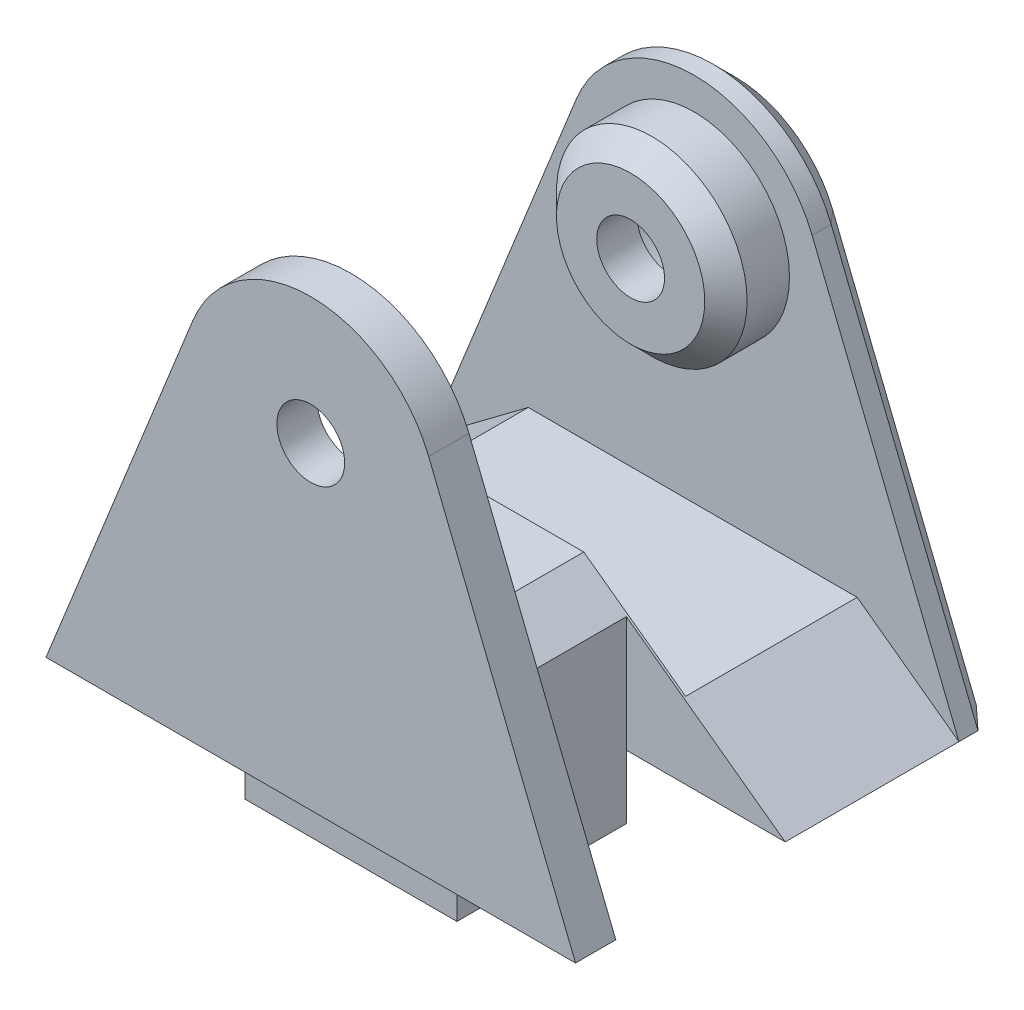
ISO-10303-21;
HEADER;
FILE_DESCRIPTION(('STEP AP214'),'2;1');
FILE_NAME('part.step','',(''),(''),'','','');
FILE_SCHEMA(('AUTOMOTIVE_DESIGN { 1 0 10303 214 1 1 1 1 }'));
ENDSEC;
DATA;
#1=APPLICATION_CONTEXT('core data for automotive mechanical design processes');
#2=APPLICATION_PROTOCOL_DEFINITION('international standard','automotive_design',2000,#1);
#3=PRODUCT_CONTEXT('',#1,'mechanical');
#4=PRODUCT('Part','Part','',(#3));
#5=PRODUCT_RELATED_PRODUCT_CATEGORY('part','',(#4));
#6=PRODUCT_DEFINITION_FORMATION('','',#4);
#7=PRODUCT_DEFINITION_CONTEXT('part definition',#1,'design');
#8=PRODUCT_DEFINITION('design','',#6,#7);
#9=PRODUCT_DEFINITION_SHAPE('','',#8);
#10=(LENGTH_UNIT() NAMED_UNIT(*) SI_UNIT(.MILLI.,.METRE.));
#11=(NAMED_UNIT(*) PLANE_ANGLE_UNIT() SI_UNIT($,.RADIAN.));
#12=(NAMED_UNIT(*) SI_UNIT($,.STERADIAN.) SOLID_ANGLE_UNIT());
#13=UNCERTAINTY_MEASURE_WITH_UNIT(LENGTH_MEASURE(1.E-05),#10,'distance_accuracy_value','');
#14=(GEOMETRIC_REPRESENTATION_CONTEXT(3) GLOBAL_UNCERTAINTY_ASSIGNED_CONTEXT((#13)) GLOBAL_UNIT_ASSIGNED_CONTEXT((#10,
#11,#12)) REPRESENTATION_CONTEXT('',''));
#15=CARTESIAN_POINT('',(0.,0.,0.));
#16=DIRECTION('',(0.,0.,1.));
#17=DIRECTION('',(1.,0.,0.));
#18=AXIS2_PLACEMENT_3D('',#15,#16,#17);
#19=CARTESIAN_POINT('',(0.,0.,10.));
#20=DIRECTION('',(0.,0.,-1.));
#21=DIRECTION('',(-1.,0.,0.));
#22=AXIS2_PLACEMENT_3D('',#19,#20,#21);
#23=CYLINDRICAL_SURFACE('',#22,1.6);
#24=CARTESIAN_POINT('',(0.,0.,-5.1));
#25=DIRECTION('',(0.,0.,1.));
#26=DIRECTION('',(1.,0.,0.));
#27=AXIS2_PLACEMENT_3D('',#24,#25,#26);
#28=CIRCLE('',#27,1.6);
#29=CARTESIAN_POINT('',(1.6,0.,-5.1));
#30=VERTEX_POINT('',#29);
#31=EDGE_CURVE('E383',#30,#30,#28,.T.);
#32=ORIENTED_EDGE('',*,*,#31,.T.);
#33=EDGE_LOOP('',(#32));
#34=FACE_BOUND('',#33,.T.);
#35=CARTESIAN_POINT('',(0.,0.,-7.));
#36=DIRECTION('',(0.,0.,-1.));
#37=DIRECTION('',(-1.,0.,0.));
#38=AXIS2_PLACEMENT_3D('',#35,#36,#37);
#39=CIRCLE('',#38,1.6);
#40=CARTESIAN_POINT('',(-1.6,0.,-7.));
#41=VERTEX_POINT('',#40);
#42=EDGE_CURVE('E379',#41,#41,#39,.T.);
#43=ORIENTED_EDGE('',*,*,#42,.T.);
#44=EDGE_LOOP('',(#43));
#45=FACE_BOUND('',#44,.T.);
#46=ADVANCED_FACE('F50',(#34,#45),#23,.F.);
#47=CARTESIAN_POINT('',(0.,0.,-8.1));
#48=DIRECTION('',(0.,0.,1.));
#49=DIRECTION('',(1.,0.,0.));
#50=AXIS2_PLACEMENT_3D('',#47,#48,#49);
#51=PLANE('',#50);
#52=DIRECTION('',(1.,0.,0.));
#53=VECTOR('',#52,1.);
#54=CARTESIAN_POINT('',(-12.5,-11.5,-8.1));
#55=LINE('',#54,#53);
#56=CARTESIAN_POINT('',(-7.83241761737377,-11.5,-8.1));
#57=VERTEX_POINT('',#56);
#58=CARTESIAN_POINT('',(7.69429140453238,-11.5,-8.1));
#59=VERTEX_POINT('',#58);
#60=EDGE_CURVE('E231',#57,#59,#55,.T.);
#61=ORIENTED_EDGE('',*,*,#60,.T.);
#62=DIRECTION('',(0.808340712738096,-0.588714949810235,0.));
#63=VECTOR('',#62,1.);
#64=CARTESIAN_POINT('',(2.88858280906475,-8.,-8.1));
#65=LINE('',#64,#63);
#66=CARTESIAN_POINT('',(12.5,-15.,-8.1));
#67=VERTEX_POINT('',#66);
#68=EDGE_CURVE('E263',#59,#67,#65,.T.);
#69=ORIENTED_EDGE('',*,*,#68,.T.);
#70=DIRECTION('',(-0.373144399215149,0.927773279058179,0.));
#71=VECTOR('',#70,1.);
#72=CARTESIAN_POINT('',(5.56663967434907,2.23886639529089,-8.1));
#73=LINE('',#72,#71);
#74=CARTESIAN_POINT('',(5.56663967434907,2.23886639529089,-8.1));
#75=VERTEX_POINT('',#74);
#76=EDGE_CURVE('E298',#67,#75,#73,.T.);
#77=ORIENTED_EDGE('',*,*,#76,.T.);
#78=CARTESIAN_POINT('',(0.,0.,-8.1));
#79=DIRECTION('',(0.,0.,1.));
#80=DIRECTION('',(1.,0.,0.));
#81=AXIS2_PLACEMENT_3D('',#78,#79,#80);
#82=CIRCLE('',#81,6.);
#83=CARTESIAN_POINT('',(-5.56663967434907,2.23886639529089,-8.1));
#84=VERTEX_POINT('',#83);
#85=EDGE_CURVE('E296',#75,#84,#82,.T.);
#86=ORIENTED_EDGE('',*,*,#85,.T.);
#87=DIRECTION('',(-0.373144399215149,-0.927773279058179,0.));
#88=VECTOR('',#87,1.);
#89=CARTESIAN_POINT('',(-12.5,-15.,-8.1));
#90=LINE('',#89,#88);
#91=CARTESIAN_POINT('',(-12.5,-15.,-8.1));
#92=VERTEX_POINT('',#91);
#93=EDGE_CURVE('E259',#84,#92,#90,.T.);
#94=ORIENTED_EDGE('',*,*,#93,.T.);
#95=DIRECTION('',(0.800056502112254,0.599924656459379,0.));
#96=VECTOR('',#95,1.);
#97=CARTESIAN_POINT('',(-12.5,-15.,-8.1));
#98=LINE('',#97,#96);
#99=EDGE_CURVE('E251',#92,#57,#98,.T.);
#100=ORIENTED_EDGE('',*,*,#99,.T.);
#101=EDGE_LOOP('',(#61,#69,#77,#86,#94,#100));
#102=FACE_BOUND('',#101,.T.);
#103=CARTESIAN_POINT('',(0.,0.,-8.1));
#104=DIRECTION('',(0.,0.,1.));
#105=DIRECTION('',(1.,0.,0.));
#106=AXIS2_PLACEMENT_3D('',#103,#104,#105);
#107=CIRCLE('',#106,4.5);
#108=CARTESIAN_POINT('',(4.5,0.,-8.1));
#109=VERTEX_POINT('',#108);
#110=EDGE_CURVE('E426',#109,#109,#107,.T.);
#111=ORIENTED_EDGE('',*,*,#110,.F.);
#112=EDGE_LOOP('',(#111));
#113=FACE_BOUND('',#112,.T.);
#114=ADVANCED_FACE('F256',(#102,#113),#51,.T.);
#115=CARTESIAN_POINT('',(12.5,-15.,10.));
#116=DIRECTION('',(0.,1.,0.));
#117=DIRECTION('',(-1.,0.,0.));
#118=AXIS2_PLACEMENT_3D('',#115,#116,#117);
#119=PLANE('',#118);
#120=DIRECTION('',(-1.,0.,0.));
#121=VECTOR('',#120,1.);
#122=CARTESIAN_POINT('',(-5.,-15.,8.1));
#123=LINE('',#122,#121);
#124=CARTESIAN_POINT('',(5.,-15.,8.1));
#125=VERTEX_POINT('',#124);
#126=CARTESIAN_POINT('',(-5.,-15.,8.1));
#127=VERTEX_POINT('',#126);
#128=EDGE_CURVE('E437',#125,#127,#123,.T.);
#129=ORIENTED_EDGE('',*,*,#128,.F.);
#130=DIRECTION('',(1.,0.,0.));
#131=VECTOR('',#130,1.);
#132=CARTESIAN_POINT('',(12.5,-15.,8.1));
#133=LINE('',#132,#131);
#134=CARTESIAN_POINT('',(12.5,-15.,8.1));
#135=VERTEX_POINT('',#134);
#136=EDGE_CURVE('E483',#125,#135,#133,.T.);
#137=ORIENTED_EDGE('',*,*,#136,.T.);
#138=DIRECTION('',(0.,0.,-1.));
#139=VECTOR('',#138,1.);
#140=CARTESIAN_POINT('',(12.5,-15.,10.));
#141=LINE('',#140,#139);
#142=CARTESIAN_POINT('',(12.5,-15.,10.));
#143=VERTEX_POINT('',#142);
#144=EDGE_CURVE('E350',#143,#135,#141,.T.);
#145=ORIENTED_EDGE('',*,*,#144,.F.);
#146=DIRECTION('',(1.,0.,0.));
#147=VECTOR('',#146,1.);
#148=CARTESIAN_POINT('',(12.5,-15.,10.));
#149=LINE('',#148,#147);
#150=CARTESIAN_POINT('',(-12.5,-15.,10.));
#151=VERTEX_POINT('',#150);
#152=EDGE_CURVE('E318',#151,#143,#149,.T.);
#153=ORIENTED_EDGE('',*,*,#152,.F.);
#154=DIRECTION('',(0.,0.,-1.));
#155=VECTOR('',#154,1.);
#156=CARTESIAN_POINT('',(-12.5,-15.,10.));
#157=LINE('',#156,#155);
#158=CARTESIAN_POINT('',(-12.5,-15.,8.1));
#159=VERTEX_POINT('',#158);
#160=EDGE_CURVE('E335',#151,#159,#157,.T.);
#161=ORIENTED_EDGE('',*,*,#160,.T.);
#162=EDGE_CURVE('E489',#159,#127,#133,.T.);
#163=ORIENTED_EDGE('',*,*,#162,.T.);
#164=EDGE_LOOP('',(#129,#137,#145,#153,#161,#163));
#165=FACE_BOUND('',#164,.T.);
#166=ADVANCED_FACE('F567',(#165),#119,.F.);
#167=DIRECTION('',(1.,0.,0.));
#168=VECTOR('',#167,1.);
#169=CARTESIAN_POINT('',(12.5,-15.,-10.));
#170=LINE('',#169,#168);
#171=CARTESIAN_POINT('',(-11.4221504622173,-15.,-10.));
#172=VERTEX_POINT('',#171);
#173=CARTESIAN_POINT('',(11.4221504622173,-15.,-10.));
#174=VERTEX_POINT('',#173);
#175=EDGE_CURVE('E317',#172,#174,#170,.T.);
#176=ORIENTED_EDGE('',*,*,#175,.T.);
#177=DIRECTION('',(0.733085178534328,0.,0.680136839917743));
#178=VECTOR('',#177,1.);
#179=CARTESIAN_POINT('',(8.7739159329794,-15.,-12.4569612329061));
#180=LINE('',#179,#178);
#181=CARTESIAN_POINT('',(12.5,-15.,-9.));
#182=VERTEX_POINT('',#181);
#183=EDGE_CURVE('E398',#174,#182,#180,.T.);
#184=ORIENTED_EDGE('',*,*,#183,.T.);
#185=EDGE_CURVE('E349',#67,#182,#141,.T.);
#186=ORIENTED_EDGE('',*,*,#185,.F.);
#187=DIRECTION('',(0.,0.,-1.));
#188=VECTOR('',#187,1.);
#189=CARTESIAN_POINT('',(12.5,-15.,8.1));
#190=LINE('',#189,#188);
#191=CARTESIAN_POINT('',(12.5,-15.,0.0999999999999994));
#192=VERTEX_POINT('',#191);
#193=EDGE_CURVE('E290',#192,#67,#190,.T.);
#194=ORIENTED_EDGE('',*,*,#193,.F.);
#195=DIRECTION('',(1.,0.,0.));
#196=VECTOR('',#195,1.);
#197=CARTESIAN_POINT('',(12.5,-15.,0.0999999999999994));
#198=LINE('',#197,#196);
#199=CARTESIAN_POINT('',(5.,-15.,0.0999999999999994));
#200=VERTEX_POINT('',#199);
#201=EDGE_CURVE('E271',#200,#192,#198,.T.);
#202=ORIENTED_EDGE('',*,*,#201,.F.);
#203=DIRECTION('',(1.,0.,0.));
#204=VECTOR('',#203,1.);
#205=CARTESIAN_POINT('',(-5.,-15.,0.0999999999999994));
#206=LINE('',#205,#204);
#207=CARTESIAN_POINT('',(-5.,-15.,0.0999999999999994));
#208=VERTEX_POINT('',#207);
#209=EDGE_CURVE('E443',#208,#200,#206,.T.);
#210=ORIENTED_EDGE('',*,*,#209,.F.);
#211=CARTESIAN_POINT('',(-12.5,-15.,0.0999999999999994));
#212=VERTEX_POINT('',#211);
#213=EDGE_CURVE('E490',#212,#208,#198,.T.);
#214=ORIENTED_EDGE('',*,*,#213,.F.);
#215=DIRECTION('',(0.,0.,-1.));
#216=VECTOR('',#215,1.);
#217=CARTESIAN_POINT('',(-12.5,-15.,8.1));
#218=LINE('',#217,#216);
#219=EDGE_CURVE('E287',#212,#92,#218,.T.);
#220=ORIENTED_EDGE('',*,*,#219,.T.);
#221=CARTESIAN_POINT('',(-12.5,-15.,-9.));
#222=VERTEX_POINT('',#221);
#223=EDGE_CURVE('E331',#92,#222,#157,.T.);
#224=ORIENTED_EDGE('',*,*,#223,.T.);
#225=DIRECTION('',(0.733085178534327,0.,-0.680136839917743));
#226=VECTOR('',#225,1.);
#227=CARTESIAN_POINT('',(-12.5,-15.,-9.));
#228=LINE('',#227,#226);
#229=EDGE_CURVE('E396',#222,#172,#228,.T.);
#230=ORIENTED_EDGE('',*,*,#229,.T.);
#231=EDGE_LOOP('',(#176,#184,#186,#194,#202,#210,#214,#220,#224,#230));
#232=FACE_BOUND('',#231,.T.);
#233=ADVANCED_FACE('F505',(#232),#119,.F.);
#234=CARTESIAN_POINT('',(2.88858280906475,-8.,8.1));
#235=DIRECTION('',(0.588714949810235,0.808340712738096,0.));
#236=DIRECTION('',(-0.808340712738096,0.588714949810235,0.));
#237=AXIS2_PLACEMENT_3D('',#234,#235,#236);
#238=PLANE('',#237);
#239=DIRECTION('',(0.808340712738096,-0.588714949810234,0.));
#240=VECTOR('',#239,1.);
#241=CARTESIAN_POINT('',(2.88858280906475,-8.,0.));
#242=LINE('',#241,#240);
#243=CARTESIAN_POINT('',(2.88858280906475,-8.,0.));
#244=VERTEX_POINT('',#243);
#245=CARTESIAN_POINT('',(7.69429140453238,-11.5,0.));
#246=VERTEX_POINT('',#245);
#247=EDGE_CURVE('E254',#244,#246,#242,.T.);
#248=ORIENTED_EDGE('',*,*,#247,.F.);
#249=DIRECTION('',(0.,0.,-1.));
#250=VECTOR('',#249,1.);
#251=CARTESIAN_POINT('',(2.88858280906475,-8.,8.1));
#252=LINE('',#251,#250);
#253=CARTESIAN_POINT('',(2.88858280906475,-8.,8.1));
#254=VERTEX_POINT('',#253);
#255=EDGE_CURVE('E280',#254,#244,#252,.T.);
#256=ORIENTED_EDGE('',*,*,#255,.F.);
#257=DIRECTION('',(0.808340712738096,-0.588714949810235,0.));
#258=VECTOR('',#257,1.);
#259=CARTESIAN_POINT('',(2.88858280906475,-8.,8.1));
#260=LINE('',#259,#258);
#261=CARTESIAN_POINT('',(5.,-9.53774620775862,8.1));
#262=VERTEX_POINT('',#261);
#263=EDGE_CURVE('E262',#254,#262,#260,.T.);
#264=ORIENTED_EDGE('',*,*,#263,.T.);
#265=DIRECTION('',(0.,0.,1.));
#266=VECTOR('',#265,1.);
#267=CARTESIAN_POINT('',(5.,-9.53774620775862,8.1));
#268=LINE('',#267,#266);
#269=CARTESIAN_POINT('',(5.,-9.53774620775862,0.0999999999999994));
#270=VERTEX_POINT('',#269);
#271=EDGE_CURVE('E364',#270,#262,#268,.T.);
#272=ORIENTED_EDGE('',*,*,#271,.F.);
#273=DIRECTION('',(0.808340712738096,-0.588714949810235,0.));
#274=VECTOR('',#273,1.);
#275=CARTESIAN_POINT('',(2.88858280906475,-8.,0.0999999999999994));
#276=LINE('',#275,#274);
#277=EDGE_CURVE('E493',#270,#192,#276,.T.);
#278=ORIENTED_EDGE('',*,*,#277,.T.);
#279=ORIENTED_EDGE('',*,*,#193,.T.);
#280=ORIENTED_EDGE('',*,*,#68,.F.);
#281=DIRECTION('',(0.,0.,-1.));
#282=VECTOR('',#281,1.);
#283=CARTESIAN_POINT('',(7.69429140453238,-11.5,8.1));
#284=LINE('',#283,#282);
#285=EDGE_CURVE('E238',#246,#59,#284,.T.);
#286=ORIENTED_EDGE('',*,*,#285,.F.);
#287=EDGE_LOOP('',(#248,#256,#264,#272,#278,#279,#280,#286));
#288=FACE_BOUND('',#287,.T.);
#289=ADVANCED_FACE('F595',(#288),#238,.T.);
#290=CARTESIAN_POINT('',(-12.5,-15.,8.1));
#291=DIRECTION('',(-0.599924656459379,0.800056502112254,0.));
#292=DIRECTION('',(-0.800056502112254,-0.599924656459379,0.));
#293=AXIS2_PLACEMENT_3D('',#290,#291,#292);
#294=PLANE('',#293);
#295=DIRECTION('',(0.800056502112255,0.599924656459379,0.));
#296=VECTOR('',#295,1.);
#297=CARTESIAN_POINT('',(-12.5,-15.,0.));
#298=LINE('',#297,#296);
#299=CARTESIAN_POINT('',(-7.83241761737377,-11.5,0.));
#300=VERTEX_POINT('',#299);
#301=CARTESIAN_POINT('',(-3.16483523474755,-8.,0.));
#302=VERTEX_POINT('',#301);
#303=EDGE_CURVE('E243',#300,#302,#298,.T.);
#304=ORIENTED_EDGE('',*,*,#303,.F.);
#305=DIRECTION('',(0.,0.,1.));
#306=VECTOR('',#305,1.);
#307=CARTESIAN_POINT('',(-7.83241761737377,-11.5,8.1));
#308=LINE('',#307,#306);
#309=EDGE_CURVE('E235',#57,#300,#308,.T.);
#310=ORIENTED_EDGE('',*,*,#309,.F.);
#311=ORIENTED_EDGE('',*,*,#99,.F.);
#312=ORIENTED_EDGE('',*,*,#219,.F.);
#313=DIRECTION('',(0.800056502112254,0.599924656459379,0.));
#314=VECTOR('',#313,1.);
#315=CARTESIAN_POINT('',(-12.5,-15.,0.0999999999999994));
#316=LINE('',#315,#314);
#317=CARTESIAN_POINT('',(-5.,-9.3761035482291,0.0999999999999994));
#318=VERTEX_POINT('',#317);
#319=EDGE_CURVE('E360',#212,#318,#316,.T.);
#320=ORIENTED_EDGE('',*,*,#319,.T.);
#321=DIRECTION('',(0.,0.,-1.));
#322=VECTOR('',#321,1.);
#323=CARTESIAN_POINT('',(-5.,-9.3761035482291,8.1));
#324=LINE('',#323,#322);
#325=CARTESIAN_POINT('',(-5.,-9.3761035482291,8.1));
#326=VERTEX_POINT('',#325);
#327=EDGE_CURVE('E354',#326,#318,#324,.T.);
#328=ORIENTED_EDGE('',*,*,#327,.F.);
#329=DIRECTION('',(0.800056502112254,0.599924656459379,0.));
#330=VECTOR('',#329,1.);
#331=CARTESIAN_POINT('',(-12.5,-15.,8.1));
#332=LINE('',#331,#330);
#333=CARTESIAN_POINT('',(-3.16483523474755,-8.,8.1));
#334=VERTEX_POINT('',#333);
#335=EDGE_CURVE('E268',#326,#334,#332,.T.);
#336=ORIENTED_EDGE('',*,*,#335,.T.);
#337=DIRECTION('',(0.,0.,-1.));
#338=VECTOR('',#337,1.);
#339=CARTESIAN_POINT('',(-3.16483523474755,-8.,8.1));
#340=LINE('',#339,#338);
#341=EDGE_CURVE('E284',#334,#302,#340,.T.);
#342=ORIENTED_EDGE('',*,*,#341,.T.);
#343=EDGE_LOOP('',(#304,#310,#311,#312,#320,#328,#336,#342));
#344=FACE_BOUND('',#343,.T.);
#345=ADVANCED_FACE('F249',(#344),#294,.T.);
#346=CARTESIAN_POINT('',(5.56663967434907,2.23886639529089,10.));
#347=DIRECTION('',(-0.927773279058179,-0.373144399215149,0.));
#348=DIRECTION('',(0.373144399215149,-0.927773279058179,0.));
#349=AXIS2_PLACEMENT_3D('',#346,#347,#348);
#350=PLANE('',#349);
#351=ORIENTED_EDGE('',*,*,#185,.T.);
#352=DIRECTION('',(-0.373144399215149,0.927773279058179,0.));
#353=VECTOR('',#352,1.);
#354=CARTESIAN_POINT('',(5.56663967434907,2.23886639529089,-9.));
#355=LINE('',#354,#353);
#356=CARTESIAN_POINT('',(5.56663967434907,2.2388663952909,-9.));
#357=VERTEX_POINT('',#356);
#358=EDGE_CURVE('E378',#182,#357,#355,.T.);
#359=ORIENTED_EDGE('',*,*,#358,.T.);
#360=DIRECTION('',(0.,0.,-1.));
#361=VECTOR('',#360,1.);
#362=CARTESIAN_POINT('',(5.56663967434907,2.2388663952909,10.));
#363=LINE('',#362,#361);
#364=EDGE_CURVE('E344',#75,#357,#363,.T.);
#365=ORIENTED_EDGE('',*,*,#364,.F.);
#366=ORIENTED_EDGE('',*,*,#76,.F.);
#367=EDGE_LOOP('',(#351,#359,#365,#366));
#368=FACE_BOUND('',#367,.T.);
#369=ADVANCED_FACE('F540',(#368),#350,.F.);
#370=CARTESIAN_POINT('',(0.,0.,10.));
#371=DIRECTION('',(0.,0.,-1.));
#372=DIRECTION('',(-1.,0.,0.));
#373=AXIS2_PLACEMENT_3D('',#370,#371,#372);
#374=CYLINDRICAL_SURFACE('',#373,6.);
#375=ORIENTED_EDGE('',*,*,#364,.T.);
#376=CARTESIAN_POINT('',(0.,0.,-9.));
#377=DIRECTION('',(0.,0.,-1.));
#378=DIRECTION('',(-1.,0.,0.));
#379=AXIS2_PLACEMENT_3D('',#376,#377,#378);
#380=CIRCLE('',#379,6.);
#381=CARTESIAN_POINT('',(-5.56663967434907,2.23886639529089,-9.));
#382=VERTEX_POINT('',#381);
#383=EDGE_CURVE('E12',#357,#382,#380,.F.);
#384=ORIENTED_EDGE('',*,*,#383,.T.);
#385=DIRECTION('',(0.,0.,-1.));
#386=VECTOR('',#385,1.);
#387=CARTESIAN_POINT('',(-5.56663967434907,2.23886639529089,10.));
#388=LINE('',#387,#386);
#389=EDGE_CURVE('E339',#84,#382,#388,.T.);
#390=ORIENTED_EDGE('',*,*,#389,.F.);
#391=ORIENTED_EDGE('',*,*,#85,.F.);
#392=EDGE_LOOP('',(#375,#384,#390,#391));
#393=FACE_BOUND('',#392,.T.);
#394=ADVANCED_FACE('F543',(#393),#374,.T.);
#395=CARTESIAN_POINT('',(-12.5,-15.,10.));
#396=DIRECTION('',(0.927773279058179,-0.373144399215149,0.));
#397=DIRECTION('',(0.373144399215149,0.927773279058179,0.));
#398=AXIS2_PLACEMENT_3D('',#395,#396,#397);
#399=PLANE('',#398);
#400=ORIENTED_EDGE('',*,*,#389,.T.);
#401=DIRECTION('',(-0.373144399215149,-0.927773279058179,0.));
#402=VECTOR('',#401,1.);
#403=CARTESIAN_POINT('',(-12.5,-15.,-9.));
#404=LINE('',#403,#402);
#405=EDGE_CURVE('E60',#382,#222,#404,.T.);
#406=ORIENTED_EDGE('',*,*,#405,.T.);
#407=ORIENTED_EDGE('',*,*,#223,.F.);
#408=ORIENTED_EDGE('',*,*,#93,.F.);
#409=EDGE_LOOP('',(#400,#406,#407,#408));
#410=FACE_BOUND('',#409,.T.);
#411=ADVANCED_FACE('F544',(#410),#399,.F.);
#412=CARTESIAN_POINT('',(0.,0.,10.));
#413=DIRECTION('',(0.,0.,-1.));
#414=DIRECTION('',(-1.,0.,0.));
#415=AXIS2_PLACEMENT_3D('',#412,#413,#414);
#416=PLANE('',#415);
#417=ORIENTED_EDGE('',*,*,#152,.T.);
#418=DIRECTION('',(-0.373144399215149,0.927773279058179,0.));
#419=VECTOR('',#418,1.);
#420=CARTESIAN_POINT('',(5.56663967434907,2.23886639529089,10.));
#421=LINE('',#420,#419);
#422=CARTESIAN_POINT('',(5.56663967434907,2.2388663952909,10.));
#423=VERTEX_POINT('',#422);
#424=EDGE_CURVE('E322',#143,#423,#421,.T.);
#425=ORIENTED_EDGE('',*,*,#424,.T.);
#426=CARTESIAN_POINT('',(0.,0.,10.));
#427=DIRECTION('',(0.,0.,1.));
#428=DIRECTION('',(-1.,0.,0.));
#429=AXIS2_PLACEMENT_3D('',#426,#427,#428);
#430=CIRCLE('',#429,6.);
#431=CARTESIAN_POINT('',(-5.56663967434907,2.23886639529089,10.));
#432=VERTEX_POINT('',#431);
#433=EDGE_CURVE('E325',#423,#432,#430,.T.);
#434=ORIENTED_EDGE('',*,*,#433,.T.);
#435=DIRECTION('',(-0.373144399215149,-0.927773279058179,0.));
#436=VECTOR('',#435,1.);
#437=CARTESIAN_POINT('',(-12.5,-15.,10.));
#438=LINE('',#437,#436);
#439=EDGE_CURVE('E328',#432,#151,#438,.T.);
#440=ORIENTED_EDGE('',*,*,#439,.T.);
#441=EDGE_LOOP('',(#417,#425,#434,#440));
#442=FACE_BOUND('',#441,.T.);
#443=CARTESIAN_POINT('',(0.,0.,10.));
#444=DIRECTION('',(0.,0.,1.));
#445=DIRECTION('',(1.,0.,0.));
#446=AXIS2_PLACEMENT_3D('',#443,#444,#445);
#447=CIRCLE('',#446,1.6);
#448=CARTESIAN_POINT('',(1.6,0.,10.));
#449=VERTEX_POINT('',#448);
#450=EDGE_CURVE('E313',#449,#449,#447,.T.);
#451=ORIENTED_EDGE('',*,*,#450,.F.);
#452=EDGE_LOOP('',(#451));
#453=FACE_BOUND('',#452,.T.);
#454=ADVANCED_FACE('F546',(#442,#453),#416,.F.);
#455=CARTESIAN_POINT('',(0.,0.,-10.));
#456=DIRECTION('',(0.,0.,-1.));
#457=DIRECTION('',(-1.,0.,0.));
#458=AXIS2_PLACEMENT_3D('',#455,#456,#457);
#459=PLANE('',#458);
#460=CARTESIAN_POINT('',(0.,0.,-10.));
#461=DIRECTION('',(0.,0.,-1.));
#462=DIRECTION('',(-1.,0.,0.));
#463=AXIS2_PLACEMENT_3D('',#460,#461,#462);
#464=CIRCLE('',#463,3.5);
#465=CARTESIAN_POINT('',(-3.5,0.,-10.));
#466=VERTEX_POINT('',#465);
#467=EDGE_CURVE('E408',#466,#466,#464,.T.);
#468=ORIENTED_EDGE('',*,*,#467,.F.);
#469=EDGE_LOOP('',(#468));
#470=FACE_BOUND('',#469,.T.);
#471=CARTESIAN_POINT('',(0.,0.,-10.));
#472=DIRECTION('',(0.,0.,-1.));
#473=DIRECTION('',(-1.,0.,0.));
#474=AXIS2_PLACEMENT_3D('',#471,#472,#473);
#475=CIRCLE('',#474,5.);
#476=CARTESIAN_POINT('',(-4.63886639529089,1.86572199607574,-10.));
#477=VERTEX_POINT('',#476);
#478=CARTESIAN_POINT('',(4.63886639529089,1.86572199607575,-10.));
#479=VERTEX_POINT('',#478);
#480=EDGE_CURVE('E388',#477,#479,#475,.T.);
#481=ORIENTED_EDGE('',*,*,#480,.T.);
#482=DIRECTION('',(0.373144399215149,-0.927773279058179,0.));
#483=VECTOR('',#482,1.);
#484=CARTESIAN_POINT('',(11.5722267209418,-15.3731443992151,-10.));
#485=LINE('',#484,#483);
#486=EDGE_CURVE('E393',#479,#174,#485,.T.);
#487=ORIENTED_EDGE('',*,*,#486,.T.);
#488=ORIENTED_EDGE('',*,*,#175,.F.);
#489=DIRECTION('',(0.373144399215149,0.927773279058179,0.));
#490=VECTOR('',#489,1.);
#491=CARTESIAN_POINT('',(-4.63886639529089,1.86572199607574,-10.));
#492=LINE('',#491,#490);
#493=EDGE_CURVE('E390',#172,#477,#492,.T.);
#494=ORIENTED_EDGE('',*,*,#493,.T.);
#495=EDGE_LOOP('',(#481,#487,#488,#494));
#496=FACE_BOUND('',#495,.T.);
#497=ADVANCED_FACE('F534',(#470,#496),#459,.T.);
#498=ORIENTED_EDGE('',*,*,#144,.T.);
#499=DIRECTION('',(-0.373144399215149,0.927773279058179,0.));
#500=VECTOR('',#499,1.);
#501=CARTESIAN_POINT('',(5.56663967434907,2.23886639529089,8.1));
#502=LINE('',#501,#500);
#503=CARTESIAN_POINT('',(5.56663967434907,2.23886639529089,8.1));
#504=VERTEX_POINT('',#503);
#505=EDGE_CURVE('E309',#135,#504,#502,.T.);
#506=ORIENTED_EDGE('',*,*,#505,.T.);
#507=EDGE_CURVE('E345',#423,#504,#363,.T.);
#508=ORIENTED_EDGE('',*,*,#507,.F.);
#509=ORIENTED_EDGE('',*,*,#424,.F.);
#510=EDGE_LOOP('',(#498,#506,#508,#509));
#511=FACE_BOUND('',#510,.T.);
#512=ADVANCED_FACE('F632',(#511),#350,.F.);
#513=ORIENTED_EDGE('',*,*,#507,.T.);
#514=CARTESIAN_POINT('',(0.,0.,8.1));
#515=DIRECTION('',(0.,0.,1.));
#516=DIRECTION('',(1.,0.,0.));
#517=AXIS2_PLACEMENT_3D('',#514,#515,#516);
#518=CIRCLE('',#517,6.);
#519=CARTESIAN_POINT('',(-5.56663967434907,2.23886639529089,8.1));
#520=VERTEX_POINT('',#519);
#521=EDGE_CURVE('E306',#504,#520,#518,.T.);
#522=ORIENTED_EDGE('',*,*,#521,.T.);
#523=EDGE_CURVE('E340',#432,#520,#388,.T.);
#524=ORIENTED_EDGE('',*,*,#523,.F.);
#525=ORIENTED_EDGE('',*,*,#433,.F.);
#526=EDGE_LOOP('',(#513,#522,#524,#525));
#527=FACE_BOUND('',#526,.T.);
#528=ADVANCED_FACE('F556',(#527),#374,.T.);
#529=ORIENTED_EDGE('',*,*,#523,.T.);
#530=DIRECTION('',(-0.373144399215149,-0.927773279058179,0.));
#531=VECTOR('',#530,1.);
#532=CARTESIAN_POINT('',(-12.5,-15.,8.1));
#533=LINE('',#532,#531);
#534=EDGE_CURVE('E302',#520,#159,#533,.T.);
#535=ORIENTED_EDGE('',*,*,#534,.T.);
#536=ORIENTED_EDGE('',*,*,#160,.F.);
#537=ORIENTED_EDGE('',*,*,#439,.F.);
#538=EDGE_LOOP('',(#529,#535,#536,#537));
#539=FACE_BOUND('',#538,.T.);
#540=ADVANCED_FACE('F548',(#539),#399,.F.);
#541=CARTESIAN_POINT('',(0.,0.,8.1));
#542=DIRECTION('',(0.,0.,1.));
#543=DIRECTION('',(1.,0.,0.));
#544=AXIS2_PLACEMENT_3D('',#541,#542,#543);
#545=CIRCLE('',#544,1.6);
#546=CARTESIAN_POINT('',(1.6,0.,8.1));
#547=VERTEX_POINT('',#546);
#548=EDGE_CURVE('E301',#547,#547,#545,.T.);
#549=ORIENTED_EDGE('',*,*,#548,.F.);
#550=EDGE_LOOP('',(#549));
#551=FACE_BOUND('',#550,.T.);
#552=ORIENTED_EDGE('',*,*,#450,.T.);
#553=EDGE_LOOP('',(#552));
#554=FACE_BOUND('',#553,.T.);
#555=ADVANCED_FACE('F559',(#551,#554),#23,.F.);
#556=CARTESIAN_POINT('',(0.,0.,8.1));
#557=DIRECTION('',(0.,0.,1.));
#558=DIRECTION('',(1.,0.,0.));
#559=AXIS2_PLACEMENT_3D('',#556,#557,#558);
#560=PLANE('',#559);
#561=ORIENTED_EDGE('',*,*,#548,.T.);
#562=EDGE_LOOP('',(#561));
#563=FACE_BOUND('',#562,.T.);
#564=ORIENTED_EDGE('',*,*,#335,.F.);
#565=DIRECTION('',(0.,1.,0.));
#566=VECTOR('',#565,1.);
#567=CARTESIAN_POINT('',(-5.,0.,8.1));
#568=LINE('',#567,#566);
#569=EDGE_CURVE('E474',#127,#326,#568,.T.);
#570=ORIENTED_EDGE('',*,*,#569,.F.);
#571=ORIENTED_EDGE('',*,*,#162,.F.);
#572=ORIENTED_EDGE('',*,*,#534,.F.);
#573=ORIENTED_EDGE('',*,*,#521,.F.);
#574=ORIENTED_EDGE('',*,*,#505,.F.);
#575=ORIENTED_EDGE('',*,*,#136,.F.);
#576=DIRECTION('',(0.,-1.,0.));
#577=VECTOR('',#576,1.);
#578=CARTESIAN_POINT('',(5.,0.,8.1));
#579=LINE('',#578,#577);
#580=EDGE_CURVE('E480',#262,#125,#579,.T.);
#581=ORIENTED_EDGE('',*,*,#580,.F.);
#582=ORIENTED_EDGE('',*,*,#263,.F.);
#583=DIRECTION('',(1.,0.,0.));
#584=VECTOR('',#583,1.);
#585=CARTESIAN_POINT('',(-3.16483523474755,-8.,8.1));
#586=LINE('',#585,#584);
#587=EDGE_CURVE('E277',#334,#254,#586,.T.);
#588=ORIENTED_EDGE('',*,*,#587,.F.);
#589=EDGE_LOOP('',(#564,#570,#571,#572,#573,#574,#575,#581,#582,#588));
#590=FACE_BOUND('',#589,.T.);
#591=ADVANCED_FACE('F572',(#563,#590),#560,.F.);
#592=CARTESIAN_POINT('',(-3.16483523474755,-8.,8.1));
#593=DIRECTION('',(0.,1.,0.));
#594=DIRECTION('',(0.,0.,1.));
#595=AXIS2_PLACEMENT_3D('',#592,#593,#594);
#596=PLANE('',#595);
#597=DIRECTION('',(1.,0.,0.));
#598=VECTOR('',#597,1.);
#599=CARTESIAN_POINT('',(-3.16483523474755,-8.,0.));
#600=LINE('',#599,#598);
#601=EDGE_CURVE('E367',#302,#244,#600,.T.);
#602=ORIENTED_EDGE('',*,*,#601,.F.);
#603=ORIENTED_EDGE('',*,*,#341,.F.);
#604=ORIENTED_EDGE('',*,*,#587,.T.);
#605=ORIENTED_EDGE('',*,*,#255,.T.);
#606=EDGE_LOOP('',(#602,#603,#604,#605));
#607=FACE_BOUND('',#606,.T.);
#608=ADVANCED_FACE('F577',(#607),#596,.T.);
#609=CARTESIAN_POINT('',(-5.,0.,0.0999999999999994));
#610=DIRECTION('',(1.,0.,0.));
#611=DIRECTION('',(0.,1.,0.));
#612=AXIS2_PLACEMENT_3D('',#609,#610,#611);
#613=PLANE('',#612);
#614=ORIENTED_EDGE('',*,*,#327,.T.);
#615=DIRECTION('',(0.,1.,0.));
#616=VECTOR('',#615,1.);
#617=CARTESIAN_POINT('',(-5.,0.,0.0999999999999994));
#618=LINE('',#617,#616);
#619=EDGE_CURVE('E475',#208,#318,#618,.T.);
#620=ORIENTED_EDGE('',*,*,#619,.F.);
#621=DIRECTION('',(0.,1.,0.));
#622=VECTOR('',#621,1.);
#623=CARTESIAN_POINT('',(-5.,-18.,0.0999999999999994));
#624=LINE('',#623,#622);
#625=CARTESIAN_POINT('',(-5.,-18.,0.0999999999999994));
#626=VERTEX_POINT('',#625);
#627=EDGE_CURVE('E462',#626,#208,#624,.T.);
#628=ORIENTED_EDGE('',*,*,#627,.F.);
#629=DIRECTION('',(0.,0.,-1.));
#630=VECTOR('',#629,1.);
#631=CARTESIAN_POINT('',(-5.,-18.,0.0999999999999994));
#632=LINE('',#631,#630);
#633=CARTESIAN_POINT('',(-5.,-18.,8.1));
#634=VERTEX_POINT('',#633);
#635=EDGE_CURVE('E446',#634,#626,#632,.T.);
#636=ORIENTED_EDGE('',*,*,#635,.F.);
#637=DIRECTION('',(0.,1.,0.));
#638=VECTOR('',#637,1.);
#639=CARTESIAN_POINT('',(-5.,-18.,8.1));
#640=LINE('',#639,#638);
#641=EDGE_CURVE('E466',#634,#127,#640,.T.);
#642=ORIENTED_EDGE('',*,*,#641,.T.);
#643=ORIENTED_EDGE('',*,*,#569,.T.);
#644=EDGE_LOOP('',(#614,#620,#628,#636,#642,#643));
#645=FACE_BOUND('',#644,.T.);
#646=ADVANCED_FACE('F523',(#645),#613,.F.);
#647=CARTESIAN_POINT('',(0.,0.,0.0999999999999994));
#648=DIRECTION('',(0.,0.,1.));
#649=DIRECTION('',(1.,0.,0.));
#650=AXIS2_PLACEMENT_3D('',#647,#648,#649);
#651=PLANE('',#650);
#652=ORIENTED_EDGE('',*,*,#213,.T.);
#653=ORIENTED_EDGE('',*,*,#619,.T.);
#654=ORIENTED_EDGE('',*,*,#319,.F.);
#655=EDGE_LOOP('',(#652,#653,#654));
#656=FACE_BOUND('',#655,.T.);
#657=ADVANCED_FACE('F526',(#656),#651,.T.);
#658=ORIENTED_EDGE('',*,*,#201,.T.);
#659=ORIENTED_EDGE('',*,*,#277,.F.);
#660=DIRECTION('',(0.,-1.,0.));
#661=VECTOR('',#660,1.);
#662=CARTESIAN_POINT('',(5.,0.,0.0999999999999994));
#663=LINE('',#662,#661);
#664=EDGE_CURVE('E479',#270,#200,#663,.T.);
#665=ORIENTED_EDGE('',*,*,#664,.T.);
#666=EDGE_LOOP('',(#658,#659,#665));
#667=FACE_BOUND('',#666,.T.);
#668=ADVANCED_FACE('F503',(#667),#651,.T.);
#669=CARTESIAN_POINT('',(5.,0.,0.0999999999999994));
#670=DIRECTION('',(-1.,0.,0.));
#671=DIRECTION('',(0.,-1.,0.));
#672=AXIS2_PLACEMENT_3D('',#669,#670,#671);
#673=PLANE('',#672);
#674=ORIENTED_EDGE('',*,*,#271,.T.);
#675=ORIENTED_EDGE('',*,*,#580,.T.);
#676=DIRECTION('',(0.,1.,0.));
#677=VECTOR('',#676,1.);
#678=CARTESIAN_POINT('',(5.,-18.,8.1));
#679=LINE('',#678,#677);
#680=CARTESIAN_POINT('',(5.,-18.,8.1));
#681=VERTEX_POINT('',#680);
#682=EDGE_CURVE('E470',#681,#125,#679,.T.);
#683=ORIENTED_EDGE('',*,*,#682,.F.);
#684=DIRECTION('',(0.,0.,1.));
#685=VECTOR('',#684,1.);
#686=CARTESIAN_POINT('',(5.,-18.,0.0999999999999994));
#687=LINE('',#686,#685);
#688=CARTESIAN_POINT('',(5.,-18.,0.0999999999999994));
#689=VERTEX_POINT('',#688);
#690=EDGE_CURVE('E438',#689,#681,#687,.T.);
#691=ORIENTED_EDGE('',*,*,#690,.F.);
#692=DIRECTION('',(0.,1.,0.));
#693=VECTOR('',#692,1.);
#694=CARTESIAN_POINT('',(5.,-18.,0.0999999999999994));
#695=LINE('',#694,#693);
#696=EDGE_CURVE('E452',#689,#200,#695,.T.);
#697=ORIENTED_EDGE('',*,*,#696,.T.);
#698=ORIENTED_EDGE('',*,*,#664,.F.);
#699=EDGE_LOOP('',(#674,#675,#683,#691,#697,#698));
#700=FACE_BOUND('',#699,.T.);
#701=ADVANCED_FACE('F515',(#700),#673,.F.);
#702=CARTESIAN_POINT('',(-5.,-18.,8.1));
#703=DIRECTION('',(0.,0.,-1.));
#704=DIRECTION('',(-1.,0.,0.));
#705=AXIS2_PLACEMENT_3D('',#702,#703,#704);
#706=PLANE('',#705);
#707=ORIENTED_EDGE('',*,*,#128,.T.);
#708=ORIENTED_EDGE('',*,*,#641,.F.);
#709=DIRECTION('',(-1.,0.,0.));
#710=VECTOR('',#709,1.);
#711=CARTESIAN_POINT('',(-5.,-18.,8.1));
#712=LINE('',#711,#710);
#713=EDGE_CURVE('E442',#681,#634,#712,.T.);
#714=ORIENTED_EDGE('',*,*,#713,.F.);
#715=ORIENTED_EDGE('',*,*,#682,.T.);
#716=EDGE_LOOP('',(#707,#708,#714,#715));
#717=FACE_BOUND('',#716,.T.);
#718=ADVANCED_FACE('F604',(#717),#706,.F.);
#719=CARTESIAN_POINT('',(-5.,-18.,0.0999999999999994));
#720=DIRECTION('',(0.,0.,1.));
#721=DIRECTION('',(1.,0.,0.));
#722=AXIS2_PLACEMENT_3D('',#719,#720,#721);
#723=PLANE('',#722);
#724=ORIENTED_EDGE('',*,*,#209,.T.);
#725=ORIENTED_EDGE('',*,*,#696,.F.);
#726=DIRECTION('',(1.,0.,0.));
#727=VECTOR('',#726,1.);
#728=CARTESIAN_POINT('',(-5.,-18.,0.0999999999999994));
#729=LINE('',#728,#727);
#730=EDGE_CURVE('E449',#626,#689,#729,.T.);
#731=ORIENTED_EDGE('',*,*,#730,.F.);
#732=ORIENTED_EDGE('',*,*,#627,.T.);
#733=EDGE_LOOP('',(#724,#725,#731,#732));
#734=FACE_BOUND('',#733,.T.);
#735=ADVANCED_FACE('F510',(#734),#723,.F.);
#736=CARTESIAN_POINT('',(0.,-18.,0.));
#737=DIRECTION('',(0.,1.,0.));
#738=DIRECTION('',(0.,0.,1.));
#739=AXIS2_PLACEMENT_3D('',#736,#737,#738);
#740=PLANE('',#739);
#741=ORIENTED_EDGE('',*,*,#690,.T.);
#742=ORIENTED_EDGE('',*,*,#713,.T.);
#743=ORIENTED_EDGE('',*,*,#635,.T.);
#744=ORIENTED_EDGE('',*,*,#730,.T.);
#745=EDGE_LOOP('',(#741,#742,#743,#744));
#746=FACE_BOUND('',#745,.T.);
#747=ADVANCED_FACE('F518',(#746),#740,.F.);
#748=CARTESIAN_POINT('',(-12.5,-8.,0.));
#749=DIRECTION('',(0.,0.,1.));
#750=DIRECTION('',(1.,0.,0.));
#751=AXIS2_PLACEMENT_3D('',#748,#749,#750);
#752=PLANE('',#751);
#753=ORIENTED_EDGE('',*,*,#247,.T.);
#754=DIRECTION('',(1.,0.,0.));
#755=VECTOR('',#754,1.);
#756=CARTESIAN_POINT('',(-12.5,-11.5,0.));
#757=LINE('',#756,#755);
#758=EDGE_CURVE('E244',#300,#246,#757,.T.);
#759=ORIENTED_EDGE('',*,*,#758,.F.);
#760=ORIENTED_EDGE('',*,*,#303,.T.);
#761=ORIENTED_EDGE('',*,*,#601,.T.);
#762=EDGE_LOOP('',(#753,#759,#760,#761));
#763=FACE_BOUND('',#762,.T.);
#764=ADVANCED_FACE('F594',(#763),#752,.F.);
#765=CARTESIAN_POINT('',(-12.5,-11.5,0.));
#766=DIRECTION('',(0.,-1.,0.));
#767=DIRECTION('',(0.,0.,-1.));
#768=AXIS2_PLACEMENT_3D('',#765,#766,#767);
#769=PLANE('',#768);
#770=ORIENTED_EDGE('',*,*,#285,.T.);
#771=ORIENTED_EDGE('',*,*,#60,.F.);
#772=ORIENTED_EDGE('',*,*,#309,.T.);
#773=ORIENTED_EDGE('',*,*,#758,.T.);
#774=EDGE_LOOP('',(#770,#771,#772,#773));
#775=FACE_BOUND('',#774,.T.);
#776=ADVANCED_FACE('F233',(#775),#769,.F.);
#777=CARTESIAN_POINT('',(0.,0.,-5.1));
#778=DIRECTION('',(0.,0.,1.));
#779=DIRECTION('',(1.,0.,0.));
#780=AXIS2_PLACEMENT_3D('',#777,#778,#779);
#781=PLANE('',#780);
#782=CARTESIAN_POINT('',(0.,0.,-5.1));
#783=DIRECTION('',(0.,0.,1.));
#784=DIRECTION('',(1.,0.,0.));
#785=AXIS2_PLACEMENT_3D('',#782,#783,#784);
#786=CIRCLE('',#785,3.5);
#787=CARTESIAN_POINT('',(3.5,0.,-5.1));
#788=VERTEX_POINT('',#787);
#789=EDGE_CURVE('E370',#788,#788,#786,.T.);
#790=ORIENTED_EDGE('',*,*,#789,.T.);
#791=EDGE_LOOP('',(#790));
#792=FACE_BOUND('',#791,.T.);
#793=ORIENTED_EDGE('',*,*,#31,.F.);
#794=EDGE_LOOP('',(#793));
#795=FACE_BOUND('',#794,.T.);
#796=ADVANCED_FACE('F668',(#792,#795),#781,.T.);
#797=CARTESIAN_POINT('',(0.,0.,-5.1));
#798=DIRECTION('',(0.,0.,-1.));
#799=DIRECTION('',(-1.,0.,0.));
#800=AXIS2_PLACEMENT_3D('',#797,#798,#799);
#801=CYLINDRICAL_SURFACE('',#800,4.5);
#802=CARTESIAN_POINT('',(0.,0.,-6.10000000000001));
#803=DIRECTION('',(0.,0.,1.));
#804=DIRECTION('',(1.,0.,0.));
#805=AXIS2_PLACEMENT_3D('',#802,#803,#804);
#806=CIRCLE('',#805,4.5);
#807=CARTESIAN_POINT('',(4.5,0.,-6.10000000000001));
#808=VERTEX_POINT('',#807);
#809=EDGE_CURVE('E374',#808,#808,#806,.F.);
#810=ORIENTED_EDGE('',*,*,#809,.T.);
#811=EDGE_LOOP('',(#810));
#812=FACE_BOUND('',#811,.T.);
#813=ORIENTED_EDGE('',*,*,#110,.T.);
#814=EDGE_LOOP('',(#813));
#815=FACE_BOUND('',#814,.T.);
#816=ADVANCED_FACE('F640',(#812,#815),#801,.T.);
#817=CARTESIAN_POINT('',(0.,0.,-5.1));
#818=DIRECTION('',(0.,0.,-1.));
#819=DIRECTION('',(-1.,0.,0.));
#820=AXIS2_PLACEMENT_3D('',#817,#818,#819);
#821=CONICAL_SURFACE('',#820,3.5,0.785398163397444);
#822=ORIENTED_EDGE('',*,*,#809,.F.);
#823=EDGE_LOOP('',(#822));
#824=FACE_BOUND('',#823,.T.);
#825=ORIENTED_EDGE('',*,*,#789,.F.);
#826=EDGE_LOOP('',(#825));
#827=FACE_BOUND('',#826,.T.);
#828=ADVANCED_FACE('F634',(#824,#827),#821,.T.);
#829=CARTESIAN_POINT('',(0.,0.,-7.));
#830=DIRECTION('',(0.,0.,-1.));
#831=DIRECTION('',(-1.,0.,0.));
#832=AXIS2_PLACEMENT_3D('',#829,#830,#831);
#833=CYLINDRICAL_SURFACE('',#832,3.5);
#834=CARTESIAN_POINT('',(0.,0.,-7.));
#835=DIRECTION('',(0.,0.,-1.));
#836=DIRECTION('',(-1.,0.,0.));
#837=AXIS2_PLACEMENT_3D('',#834,#835,#836);
#838=CIRCLE('',#837,3.5);
#839=CARTESIAN_POINT('',(-3.5,0.,-7.));
#840=VERTEX_POINT('',#839);
#841=EDGE_CURVE('E384',#840,#840,#838,.T.);
#842=ORIENTED_EDGE('',*,*,#841,.F.);
#843=EDGE_LOOP('',(#842));
#844=FACE_BOUND('',#843,.T.);
#845=ORIENTED_EDGE('',*,*,#467,.T.);
#846=EDGE_LOOP('',(#845));
#847=FACE_BOUND('',#846,.T.);
#848=ADVANCED_FACE('F639',(#844,#847),#833,.F.);
#849=CARTESIAN_POINT('',(0.,0.,-7.));
#850=DIRECTION('',(0.,0.,-1.));
#851=DIRECTION('',(-1.,0.,0.));
#852=AXIS2_PLACEMENT_3D('',#849,#850,#851);
#853=PLANE('',#852);
#854=ORIENTED_EDGE('',*,*,#42,.F.);
#855=EDGE_LOOP('',(#854));
#856=FACE_BOUND('',#855,.T.);
#857=ORIENTED_EDGE('',*,*,#841,.T.);
#858=EDGE_LOOP('',(#857));
#859=FACE_BOUND('',#858,.T.);
#860=ADVANCED_FACE('F654',(#856,#859),#853,.T.);
#861=CARTESIAN_POINT('',(-12.5,-15.,-9.));
#862=DIRECTION('',(-0.656034777025718,0.263852935046812,-0.707106781186547));
#863=DIRECTION('',(0.373144399215149,0.927773279058179,0.));
#864=AXIS2_PLACEMENT_3D('',#861,#862,#863);
#865=PLANE('',#864);
#866=ORIENTED_EDGE('',*,*,#229,.F.);
#867=ORIENTED_EDGE('',*,*,#405,.F.);
#868=DIRECTION('',(-0.656034777025717,0.263852935046812,0.707106781186548));
#869=VECTOR('',#868,1.);
#870=CARTESIAN_POINT('',(-4.63886639529089,1.86572199607574,-10.));
#871=LINE('',#870,#869);
#872=EDGE_CURVE('E55',#477,#382,#871,.T.);
#873=ORIENTED_EDGE('',*,*,#872,.F.);
#874=ORIENTED_EDGE('',*,*,#493,.F.);
#875=EDGE_LOOP('',(#866,#867,#873,#874));
#876=FACE_BOUND('',#875,.T.);
#877=ADVANCED_FACE('F53',(#876),#865,.T.);
#878=CARTESIAN_POINT('',(0.,0.,-9.));
#879=DIRECTION('',(0.,0.,1.));
#880=DIRECTION('',(1.,0.,0.));
#881=AXIS2_PLACEMENT_3D('',#878,#879,#880);
#882=CONICAL_SURFACE('',#881,6.,0.785398163397449);
#883=ORIENTED_EDGE('',*,*,#872,.T.);
#884=ORIENTED_EDGE('',*,*,#383,.F.);
#885=DIRECTION('',(0.656034777025718,0.263852935046813,0.707106781186547));
#886=VECTOR('',#885,1.);
#887=CARTESIAN_POINT('',(4.63886639529089,1.86572199607575,-10.));
#888=LINE('',#887,#886);
#889=EDGE_CURVE('E402',#479,#357,#888,.T.);
#890=ORIENTED_EDGE('',*,*,#889,.F.);
#891=ORIENTED_EDGE('',*,*,#480,.F.);
#892=EDGE_LOOP('',(#883,#884,#890,#891));
#893=FACE_BOUND('',#892,.T.);
#894=ADVANCED_FACE('F647',(#893),#882,.T.);
#895=CARTESIAN_POINT('',(5.56663967434907,2.23886639529089,-9.));
#896=DIRECTION('',(0.656034777025717,0.263852935046812,-0.707106781186548));
#897=DIRECTION('',(0.373144399215149,-0.927773279058179,0.));
#898=AXIS2_PLACEMENT_3D('',#895,#896,#897);
#899=PLANE('',#898);
#900=ORIENTED_EDGE('',*,*,#183,.F.);
#901=ORIENTED_EDGE('',*,*,#486,.F.);
#902=ORIENTED_EDGE('',*,*,#889,.T.);
#903=ORIENTED_EDGE('',*,*,#358,.F.);
#904=EDGE_LOOP('',(#900,#901,#902,#903));
#905=FACE_BOUND('',#904,.T.);
#906=ADVANCED_FACE('F537',(#905),#899,.T.);
#907=CLOSED_SHELL('',(#46,#114,#166,#233,#289,#345,#369,#394,#411,#454,#497,#512,#528,#540,#555,
#591,#608,#646,#657,#668,#701,#718,#735,#747,#764,#776,#796,#816,#828,#848,#860,#877,#894,#906));
#908=MANIFOLD_SOLID_BREP('B2',#907);
#909=ADVANCED_BREP_SHAPE_REPRESENTATION('',(#18,#908),#14);
#910=SHAPE_DEFINITION_REPRESENTATION(#9,#909);
ENDSEC;
END-ISO-10303-21;
